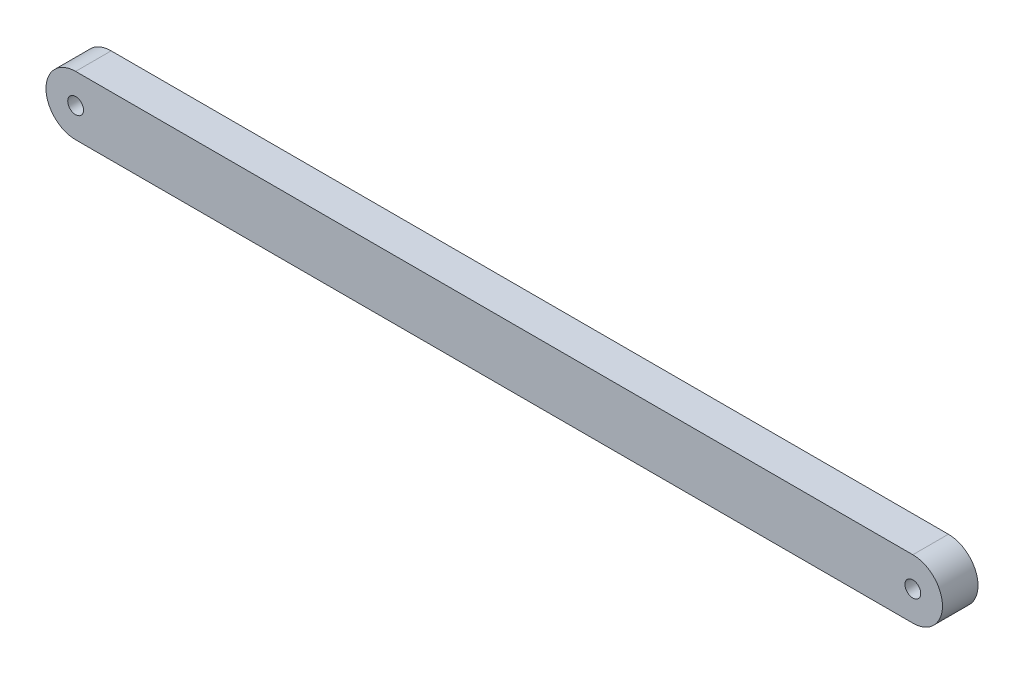
ISO-10303-21;
HEADER;
FILE_DESCRIPTION(('STEP AP214'),'2;1');
FILE_NAME('part.step','',(''),(''),'','','');
FILE_SCHEMA(('AUTOMOTIVE_DESIGN { 1 0 10303 214 1 1 1 1 }'));
ENDSEC;
DATA;
#1=APPLICATION_CONTEXT('core data for automotive mechanical design processes');
#2=APPLICATION_PROTOCOL_DEFINITION('international standard','automotive_design',2000,#1);
#3=PRODUCT_CONTEXT('',#1,'mechanical');
#4=PRODUCT('Part','Part','',(#3));
#5=PRODUCT_RELATED_PRODUCT_CATEGORY('part','',(#4));
#6=PRODUCT_DEFINITION_FORMATION('','',#4);
#7=PRODUCT_DEFINITION_CONTEXT('part definition',#1,'design');
#8=PRODUCT_DEFINITION('design','',#6,#7);
#9=PRODUCT_DEFINITION_SHAPE('','',#8);
#10=(LENGTH_UNIT() NAMED_UNIT(*) SI_UNIT(.MILLI.,.METRE.));
#11=(NAMED_UNIT(*) PLANE_ANGLE_UNIT() SI_UNIT($,.RADIAN.));
#12=(NAMED_UNIT(*) SI_UNIT($,.STERADIAN.) SOLID_ANGLE_UNIT());
#13=UNCERTAINTY_MEASURE_WITH_UNIT(LENGTH_MEASURE(1.E-05),#10,'distance_accuracy_value','');
#14=(GEOMETRIC_REPRESENTATION_CONTEXT(3) GLOBAL_UNCERTAINTY_ASSIGNED_CONTEXT((#13)) GLOBAL_UNIT_ASSIGNED_CONTEXT((#10,
#11,#12)) REPRESENTATION_CONTEXT('',''));
#15=CARTESIAN_POINT('',(0.,0.,0.));
#16=DIRECTION('',(0.,0.,1.));
#17=DIRECTION('',(1.,0.,0.));
#18=AXIS2_PLACEMENT_3D('',#15,#16,#17);
#19=CARTESIAN_POINT('',(0.,0.,18.));
#20=DIRECTION('',(0.,0.,1.));
#21=DIRECTION('',(1.,0.,0.));
#22=AXIS2_PLACEMENT_3D('',#19,#20,#21);
#23=PLANE('',#22);
#24=CARTESIAN_POINT('',(0.,0.,18.));
#25=DIRECTION('',(0.,0.,1.));
#26=DIRECTION('',(1.,0.,0.));
#27=AXIS2_PLACEMENT_3D('',#24,#25,#26);
#28=CIRCLE('',#27,4.);
#29=CARTESIAN_POINT('',(4.,0.,18.));
#30=VERTEX_POINT('',#29);
#31=EDGE_CURVE('E118',#30,#30,#28,.T.);
#32=ORIENTED_EDGE('',*,*,#31,.F.);
#33=EDGE_LOOP('',(#32));
#34=FACE_BOUND('',#33,.T.);
#35=CARTESIAN_POINT('',(0.,0.,18.));
#36=DIRECTION('',(0.,0.,1.));
#37=DIRECTION('',(1.,0.,0.));
#38=AXIS2_PLACEMENT_3D('',#35,#36,#37);
#39=CIRCLE('',#38,15.);
#40=CARTESIAN_POINT('',(0.,15.,18.));
#41=VERTEX_POINT('',#40);
#42=CARTESIAN_POINT('',(0.,-15.,18.));
#43=VERTEX_POINT('',#42);
#44=EDGE_CURVE('E98',#41,#43,#39,.T.);
#45=ORIENTED_EDGE('',*,*,#44,.T.);
#46=DIRECTION('',(1.,0.,0.));
#47=VECTOR('',#46,1.);
#48=CARTESIAN_POINT('',(0.,-15.,18.));
#49=LINE('',#48,#47);
#50=CARTESIAN_POINT('',(423.93,-15.,18.));
#51=VERTEX_POINT('',#50);
#52=EDGE_CURVE('E93',#43,#51,#49,.T.);
#53=ORIENTED_EDGE('',*,*,#52,.T.);
#54=CARTESIAN_POINT('',(423.93,0.,18.));
#55=DIRECTION('',(0.,0.,1.));
#56=DIRECTION('',(1.,0.,0.));
#57=AXIS2_PLACEMENT_3D('',#54,#55,#56);
#58=CIRCLE('',#57,15.);
#59=CARTESIAN_POINT('',(423.93,15.,18.));
#60=VERTEX_POINT('',#59);
#61=EDGE_CURVE('E96',#51,#60,#58,.T.);
#62=ORIENTED_EDGE('',*,*,#61,.T.);
#63=DIRECTION('',(-1.,0.,0.));
#64=VECTOR('',#63,1.);
#65=CARTESIAN_POINT('',(0.,15.,18.));
#66=LINE('',#65,#64);
#67=EDGE_CURVE('E63',#60,#41,#66,.T.);
#68=ORIENTED_EDGE('',*,*,#67,.T.);
#69=EDGE_LOOP('',(#45,#53,#62,#68));
#70=FACE_BOUND('',#69,.T.);
#71=CARTESIAN_POINT('',(423.93,0.,18.));
#72=DIRECTION('',(0.,0.,1.));
#73=DIRECTION('',(1.,0.,0.));
#74=AXIS2_PLACEMENT_3D('',#71,#72,#73);
#75=CIRCLE('',#74,3.99999999999999);
#76=CARTESIAN_POINT('',(427.93,0.,18.));
#77=VERTEX_POINT('',#76);
#78=EDGE_CURVE('E140',#77,#77,#75,.T.);
#79=ORIENTED_EDGE('',*,*,#78,.F.);
#80=EDGE_LOOP('',(#79));
#81=FACE_BOUND('',#80,.T.);
#82=ADVANCED_FACE('F45',(#34,#70,#81),#23,.T.);
#83=CARTESIAN_POINT('',(0.,0.,0.));
#84=DIRECTION('',(0.,0.,1.));
#85=DIRECTION('',(1.,0.,0.));
#86=AXIS2_PLACEMENT_3D('',#83,#84,#85);
#87=PLANE('',#86);
#88=CARTESIAN_POINT('',(0.,0.,0.));
#89=DIRECTION('',(0.,0.,1.));
#90=DIRECTION('',(1.,0.,0.));
#91=AXIS2_PLACEMENT_3D('',#88,#89,#90);
#92=CIRCLE('',#91,15.);
#93=CARTESIAN_POINT('',(0.,15.,0.));
#94=VERTEX_POINT('',#93);
#95=CARTESIAN_POINT('',(0.,-15.,0.));
#96=VERTEX_POINT('',#95);
#97=EDGE_CURVE('E114',#94,#96,#92,.T.);
#98=ORIENTED_EDGE('',*,*,#97,.F.);
#99=DIRECTION('',(-1.,0.,0.));
#100=VECTOR('',#99,1.);
#101=CARTESIAN_POINT('',(0.,15.,0.));
#102=LINE('',#101,#100);
#103=CARTESIAN_POINT('',(423.93,15.,0.));
#104=VERTEX_POINT('',#103);
#105=EDGE_CURVE('E86',#104,#94,#102,.T.);
#106=ORIENTED_EDGE('',*,*,#105,.F.);
#107=CARTESIAN_POINT('',(423.93,0.,0.));
#108=DIRECTION('',(0.,0.,1.));
#109=DIRECTION('',(1.,0.,0.));
#110=AXIS2_PLACEMENT_3D('',#107,#108,#109);
#111=CIRCLE('',#110,15.);
#112=CARTESIAN_POINT('',(423.93,-15.,0.));
#113=VERTEX_POINT('',#112);
#114=EDGE_CURVE('E80',#113,#104,#111,.T.);
#115=ORIENTED_EDGE('',*,*,#114,.F.);
#116=DIRECTION('',(1.,0.,0.));
#117=VECTOR('',#116,1.);
#118=CARTESIAN_POINT('',(0.,-15.,0.));
#119=LINE('',#118,#117);
#120=EDGE_CURVE('E103',#96,#113,#119,.T.);
#121=ORIENTED_EDGE('',*,*,#120,.F.);
#122=EDGE_LOOP('',(#98,#106,#115,#121));
#123=FACE_BOUND('',#122,.T.);
#124=CARTESIAN_POINT('',(0.,0.,0.));
#125=DIRECTION('',(0.,0.,1.));
#126=DIRECTION('',(1.,0.,0.));
#127=AXIS2_PLACEMENT_3D('',#124,#125,#126);
#128=CIRCLE('',#127,4.);
#129=CARTESIAN_POINT('',(4.,0.,0.));
#130=VERTEX_POINT('',#129);
#131=EDGE_CURVE('E136',#130,#130,#128,.T.);
#132=ORIENTED_EDGE('',*,*,#131,.T.);
#133=EDGE_LOOP('',(#132));
#134=FACE_BOUND('',#133,.T.);
#135=CARTESIAN_POINT('',(423.93,0.,0.));
#136=DIRECTION('',(0.,0.,1.));
#137=DIRECTION('',(1.,0.,0.));
#138=AXIS2_PLACEMENT_3D('',#135,#136,#137);
#139=CIRCLE('',#138,3.99999999999999);
#140=CARTESIAN_POINT('',(427.93,0.,0.));
#141=VERTEX_POINT('',#140);
#142=EDGE_CURVE('E144',#141,#141,#139,.T.);
#143=ORIENTED_EDGE('',*,*,#142,.T.);
#144=EDGE_LOOP('',(#143));
#145=FACE_BOUND('',#144,.T.);
#146=ADVANCED_FACE('F131',(#123,#134,#145),#87,.F.);
#147=CARTESIAN_POINT('',(0.,0.,18.));
#148=DIRECTION('',(0.,0.,-1.));
#149=DIRECTION('',(-1.,0.,0.));
#150=AXIS2_PLACEMENT_3D('',#147,#148,#149);
#151=CYLINDRICAL_SURFACE('',#150,15.);
#152=ORIENTED_EDGE('',*,*,#97,.T.);
#153=DIRECTION('',(0.,0.,-1.));
#154=VECTOR('',#153,1.);
#155=CARTESIAN_POINT('',(0.,-15.,18.));
#156=LINE('',#155,#154);
#157=EDGE_CURVE('E11',#43,#96,#156,.T.);
#158=ORIENTED_EDGE('',*,*,#157,.F.);
#159=ORIENTED_EDGE('',*,*,#44,.F.);
#160=DIRECTION('',(0.,0.,-1.));
#161=VECTOR('',#160,1.);
#162=CARTESIAN_POINT('',(0.,15.,18.));
#163=LINE('',#162,#161);
#164=EDGE_CURVE('E110',#41,#94,#163,.T.);
#165=ORIENTED_EDGE('',*,*,#164,.T.);
#166=EDGE_LOOP('',(#152,#158,#159,#165));
#167=FACE_BOUND('',#166,.T.);
#168=ADVANCED_FACE('F47',(#167),#151,.T.);
#169=CARTESIAN_POINT('',(0.,-15.,18.));
#170=DIRECTION('',(0.,1.,0.));
#171=DIRECTION('',(-1.,0.,0.));
#172=AXIS2_PLACEMENT_3D('',#169,#170,#171);
#173=PLANE('',#172);
#174=ORIENTED_EDGE('',*,*,#120,.T.);
#175=DIRECTION('',(0.,0.,-1.));
#176=VECTOR('',#175,1.);
#177=CARTESIAN_POINT('',(423.93,-15.,18.));
#178=LINE('',#177,#176);
#179=EDGE_CURVE('E55',#51,#113,#178,.T.);
#180=ORIENTED_EDGE('',*,*,#179,.F.);
#181=ORIENTED_EDGE('',*,*,#52,.F.);
#182=ORIENTED_EDGE('',*,*,#157,.T.);
#183=EDGE_LOOP('',(#174,#180,#181,#182));
#184=FACE_BOUND('',#183,.T.);
#185=ADVANCED_FACE('F102',(#184),#173,.F.);
#186=CARTESIAN_POINT('',(423.93,0.,18.));
#187=DIRECTION('',(0.,0.,-1.));
#188=DIRECTION('',(-1.,0.,0.));
#189=AXIS2_PLACEMENT_3D('',#186,#187,#188);
#190=CYLINDRICAL_SURFACE('',#189,15.);
#191=ORIENTED_EDGE('',*,*,#114,.T.);
#192=DIRECTION('',(0.,0.,-1.));
#193=VECTOR('',#192,1.);
#194=CARTESIAN_POINT('',(423.93,15.,18.));
#195=LINE('',#194,#193);
#196=EDGE_CURVE('E105',#60,#104,#195,.T.);
#197=ORIENTED_EDGE('',*,*,#196,.F.);
#198=ORIENTED_EDGE('',*,*,#61,.F.);
#199=ORIENTED_EDGE('',*,*,#179,.T.);
#200=EDGE_LOOP('',(#191,#197,#198,#199));
#201=FACE_BOUND('',#200,.T.);
#202=ADVANCED_FACE('F106',(#201),#190,.T.);
#203=CARTESIAN_POINT('',(0.,15.,18.));
#204=DIRECTION('',(0.,-1.,0.));
#205=DIRECTION('',(1.,0.,0.));
#206=AXIS2_PLACEMENT_3D('',#203,#204,#205);
#207=PLANE('',#206);
#208=ORIENTED_EDGE('',*,*,#105,.T.);
#209=ORIENTED_EDGE('',*,*,#164,.F.);
#210=ORIENTED_EDGE('',*,*,#67,.F.);
#211=ORIENTED_EDGE('',*,*,#196,.T.);
#212=EDGE_LOOP('',(#208,#209,#210,#211));
#213=FACE_BOUND('',#212,.T.);
#214=ADVANCED_FACE('F128',(#213),#207,.F.);
#215=CARTESIAN_POINT('',(0.,0.,18.));
#216=DIRECTION('',(0.,0.,-1.));
#217=DIRECTION('',(-1.,0.,0.));
#218=AXIS2_PLACEMENT_3D('',#215,#216,#217);
#219=CYLINDRICAL_SURFACE('',#218,4.);
#220=ORIENTED_EDGE('',*,*,#31,.T.);
#221=EDGE_LOOP('',(#220));
#222=FACE_BOUND('',#221,.T.);
#223=ORIENTED_EDGE('',*,*,#131,.F.);
#224=EDGE_LOOP('',(#223));
#225=FACE_BOUND('',#224,.T.);
#226=ADVANCED_FACE('F163',(#222,#225),#219,.F.);
#227=CARTESIAN_POINT('',(423.93,0.,18.));
#228=DIRECTION('',(0.,0.,-1.));
#229=DIRECTION('',(-1.,0.,0.));
#230=AXIS2_PLACEMENT_3D('',#227,#228,#229);
#231=CYLINDRICAL_SURFACE('',#230,3.99999999999999);
#232=ORIENTED_EDGE('',*,*,#78,.T.);
#233=EDGE_LOOP('',(#232));
#234=FACE_BOUND('',#233,.T.);
#235=ORIENTED_EDGE('',*,*,#142,.F.);
#236=EDGE_LOOP('',(#235));
#237=FACE_BOUND('',#236,.T.);
#238=ADVANCED_FACE('F152',(#234,#237),#231,.F.);
#239=CLOSED_SHELL('',(#82,#146,#168,#185,#202,#214,#226,#238));
#240=MANIFOLD_SOLID_BREP('B2',#239);
#241=ADVANCED_BREP_SHAPE_REPRESENTATION('',(#18,#240),#14);
#242=SHAPE_DEFINITION_REPRESENTATION(#9,#241);
ENDSEC;
END-ISO-10303-21;
